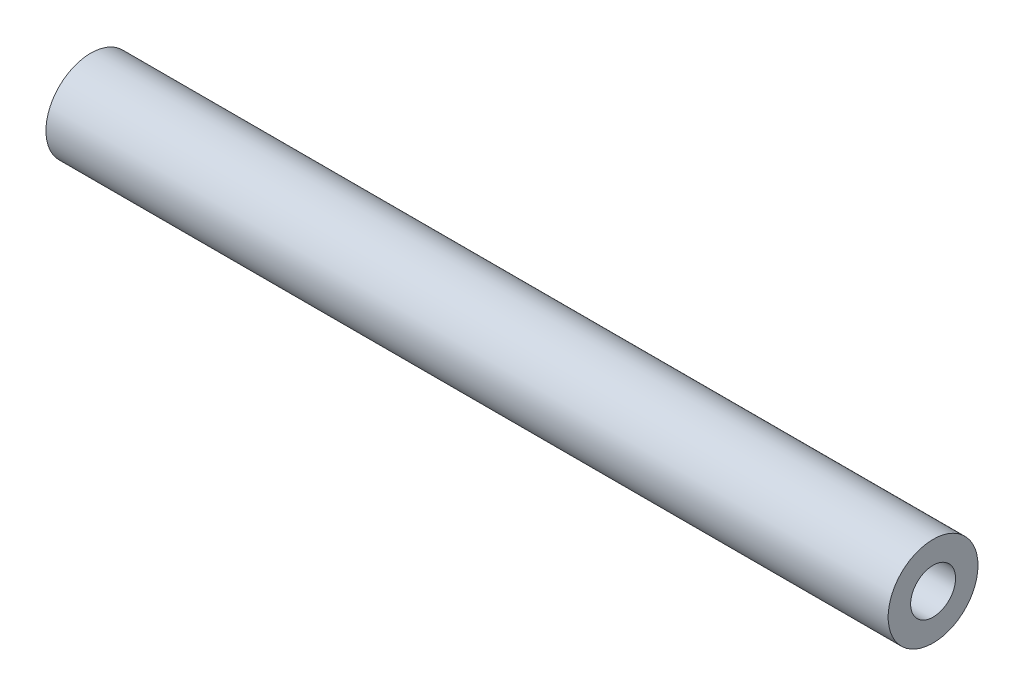
ISO-10303-21;
HEADER;
FILE_DESCRIPTION(('STEP AP214'),'2;1');
FILE_NAME('part.step','',(''),(''),'','','');
FILE_SCHEMA(('AUTOMOTIVE_DESIGN { 1 0 10303 214 1 1 1 1 }'));
ENDSEC;
DATA;
#1=APPLICATION_CONTEXT('core data for automotive mechanical design processes');
#2=APPLICATION_PROTOCOL_DEFINITION('international standard','automotive_design',2000,#1);
#3=PRODUCT_CONTEXT('',#1,'mechanical');
#4=PRODUCT('Part','Part','',(#3));
#5=PRODUCT_RELATED_PRODUCT_CATEGORY('part','',(#4));
#6=PRODUCT_DEFINITION_FORMATION('','',#4);
#7=PRODUCT_DEFINITION_CONTEXT('part definition',#1,'design');
#8=PRODUCT_DEFINITION('design','',#6,#7);
#9=PRODUCT_DEFINITION_SHAPE('','',#8);
#10=(LENGTH_UNIT() NAMED_UNIT(*) SI_UNIT(.MILLI.,.METRE.));
#11=(NAMED_UNIT(*) PLANE_ANGLE_UNIT() SI_UNIT($,.RADIAN.));
#12=(NAMED_UNIT(*) SI_UNIT($,.STERADIAN.) SOLID_ANGLE_UNIT());
#13=UNCERTAINTY_MEASURE_WITH_UNIT(LENGTH_MEASURE(1.E-05),#10,'distance_accuracy_value','');
#14=(GEOMETRIC_REPRESENTATION_CONTEXT(3) GLOBAL_UNCERTAINTY_ASSIGNED_CONTEXT((#13)) GLOBAL_UNIT_ASSIGNED_CONTEXT((#10,
#11,#12)) REPRESENTATION_CONTEXT('',''));
#15=CARTESIAN_POINT('',(0.,0.,0.));
#16=DIRECTION('',(0.,0.,1.));
#17=DIRECTION('',(1.,0.,0.));
#18=AXIS2_PLACEMENT_3D('',#15,#16,#17);
#19=CARTESIAN_POINT('',(37.5,0.,0.));
#20=DIRECTION('',(-1.,0.,0.));
#21=DIRECTION('',(0.,0.,1.));
#22=AXIS2_PLACEMENT_3D('',#19,#20,#21);
#23=CYLINDRICAL_SURFACE('',#22,4.);
#24=CARTESIAN_POINT('',(37.5,0.,0.));
#25=DIRECTION('',(1.,0.,0.));
#26=DIRECTION('',(0.,0.,-1.));
#27=AXIS2_PLACEMENT_3D('',#24,#25,#26);
#28=CIRCLE('',#27,4.);
#29=CARTESIAN_POINT('',(37.5,0.,-4.00000000000003));
#30=VERTEX_POINT('',#29);
#31=EDGE_CURVE('E10',#30,#30,#28,.T.);
#32=ORIENTED_EDGE('',*,*,#31,.F.);
#33=EDGE_LOOP('',(#32));
#34=FACE_BOUND('',#33,.T.);
#35=CARTESIAN_POINT('',(-37.5,0.,0.));
#36=DIRECTION('',(1.,0.,0.));
#37=DIRECTION('',(0.,0.,-1.));
#38=AXIS2_PLACEMENT_3D('',#35,#36,#37);
#39=CIRCLE('',#38,4.);
#40=CARTESIAN_POINT('',(-37.5,0.,-4.00000000000001));
#41=VERTEX_POINT('',#40);
#42=EDGE_CURVE('E42',#41,#41,#39,.T.);
#43=ORIENTED_EDGE('',*,*,#42,.T.);
#44=EDGE_LOOP('',(#43));
#45=FACE_BOUND('',#44,.T.);
#46=ADVANCED_FACE('F39',(#34,#45),#23,.T.);
#47=CARTESIAN_POINT('',(37.5,0.,0.));
#48=DIRECTION('',(1.,0.,0.));
#49=DIRECTION('',(0.,0.,-1.));
#50=AXIS2_PLACEMENT_3D('',#47,#48,#49);
#51=PLANE('',#50);
#52=CARTESIAN_POINT('',(37.5,0.,0.));
#53=DIRECTION('',(1.,0.,0.));
#54=DIRECTION('',(0.,0.,-1.));
#55=AXIS2_PLACEMENT_3D('',#52,#53,#54);
#56=CIRCLE('',#55,2.);
#57=CARTESIAN_POINT('',(37.5,0.,-2.00000000000003));
#58=VERTEX_POINT('',#57);
#59=EDGE_CURVE('E54',#58,#58,#56,.T.);
#60=ORIENTED_EDGE('',*,*,#59,.F.);
#61=EDGE_LOOP('',(#60));
#62=FACE_BOUND('',#61,.T.);
#63=ORIENTED_EDGE('',*,*,#31,.T.);
#64=EDGE_LOOP('',(#63));
#65=FACE_BOUND('',#64,.T.);
#66=ADVANCED_FACE('F83',(#62,#65),#51,.T.);
#67=CARTESIAN_POINT('',(-37.5,0.,0.));
#68=DIRECTION('',(1.,0.,0.));
#69=DIRECTION('',(0.,0.,-1.));
#70=AXIS2_PLACEMENT_3D('',#67,#68,#69);
#71=PLANE('',#70);
#72=CARTESIAN_POINT('',(-37.5,0.,0.));
#73=DIRECTION('',(1.,0.,0.));
#74=DIRECTION('',(0.,0.,-1.));
#75=AXIS2_PLACEMENT_3D('',#72,#73,#74);
#76=CIRCLE('',#75,2.);
#77=CARTESIAN_POINT('',(-37.5,0.,-2.00000000000001));
#78=VERTEX_POINT('',#77);
#79=EDGE_CURVE('E62',#78,#78,#76,.T.);
#80=ORIENTED_EDGE('',*,*,#79,.T.);
#81=EDGE_LOOP('',(#80));
#82=FACE_BOUND('',#81,.T.);
#83=ORIENTED_EDGE('',*,*,#42,.F.);
#84=EDGE_LOOP('',(#83));
#85=FACE_BOUND('',#84,.T.);
#86=ADVANCED_FACE('F88',(#82,#85),#71,.F.);
#87=CARTESIAN_POINT('',(22.5,0.,0.));
#88=DIRECTION('',(1.,0.,0.));
#89=DIRECTION('',(0.,0.,-1.));
#90=AXIS2_PLACEMENT_3D('',#87,#88,#89);
#91=CYLINDRICAL_SURFACE('',#90,2.);
#92=CARTESIAN_POINT('',(22.5,0.,0.));
#93=DIRECTION('',(1.,0.,0.));
#94=DIRECTION('',(0.,0.,-1.));
#95=AXIS2_PLACEMENT_3D('',#92,#93,#94);
#96=CIRCLE('',#95,2.);
#97=CARTESIAN_POINT('',(22.5,0.,-2.00000000000006));
#98=VERTEX_POINT('',#97);
#99=EDGE_CURVE('E52',#98,#98,#96,.T.);
#100=ORIENTED_EDGE('',*,*,#99,.F.);
#101=EDGE_LOOP('',(#100));
#102=FACE_BOUND('',#101,.T.);
#103=ORIENTED_EDGE('',*,*,#59,.T.);
#104=EDGE_LOOP('',(#103));
#105=FACE_BOUND('',#104,.T.);
#106=ADVANCED_FACE('F95',(#102,#105),#91,.F.);
#107=CARTESIAN_POINT('',(22.5,0.,0.));
#108=DIRECTION('',(1.,0.,0.));
#109=DIRECTION('',(0.,0.,-1.));
#110=AXIS2_PLACEMENT_3D('',#107,#108,#109);
#111=PLANE('',#110);
#112=ORIENTED_EDGE('',*,*,#99,.T.);
#113=EDGE_LOOP('',(#112));
#114=FACE_BOUND('',#113,.T.);
#115=ADVANCED_FACE('F80',(#114),#111,.T.);
#116=CARTESIAN_POINT('',(-22.5,0.,0.));
#117=DIRECTION('',(-1.,0.,0.));
#118=DIRECTION('',(0.,0.,1.));
#119=AXIS2_PLACEMENT_3D('',#116,#117,#118);
#120=CYLINDRICAL_SURFACE('',#119,2.);
#121=CARTESIAN_POINT('',(-22.5,0.,0.));
#122=DIRECTION('',(1.,0.,0.));
#123=DIRECTION('',(0.,0.,-1.));
#124=AXIS2_PLACEMENT_3D('',#121,#122,#123);
#125=CIRCLE('',#124,2.);
#126=CARTESIAN_POINT('',(-22.5,0.,-2.00000000000004));
#127=VERTEX_POINT('',#126);
#128=EDGE_CURVE('E58',#127,#127,#125,.T.);
#129=ORIENTED_EDGE('',*,*,#128,.T.);
#130=EDGE_LOOP('',(#129));
#131=FACE_BOUND('',#130,.T.);
#132=ORIENTED_EDGE('',*,*,#79,.F.);
#133=EDGE_LOOP('',(#132));
#134=FACE_BOUND('',#133,.T.);
#135=ADVANCED_FACE('F71',(#131,#134),#120,.F.);
#136=CARTESIAN_POINT('',(-22.5,0.,0.));
#137=DIRECTION('',(-1.,0.,0.));
#138=DIRECTION('',(0.,0.,-1.));
#139=AXIS2_PLACEMENT_3D('',#136,#137,#138);
#140=PLANE('',#139);
#141=ORIENTED_EDGE('',*,*,#128,.F.);
#142=EDGE_LOOP('',(#141));
#143=FACE_BOUND('',#142,.T.);
#144=ADVANCED_FACE('F74',(#143),#140,.T.);
#145=CLOSED_SHELL('',(#46,#66,#86,#106,#115,#135,#144));
#146=MANIFOLD_SOLID_BREP('B2',#145);
#147=ADVANCED_BREP_SHAPE_REPRESENTATION('',(#18,#146),#14);
#148=SHAPE_DEFINITION_REPRESENTATION(#9,#147);
ENDSEC;
END-ISO-10303-21;
